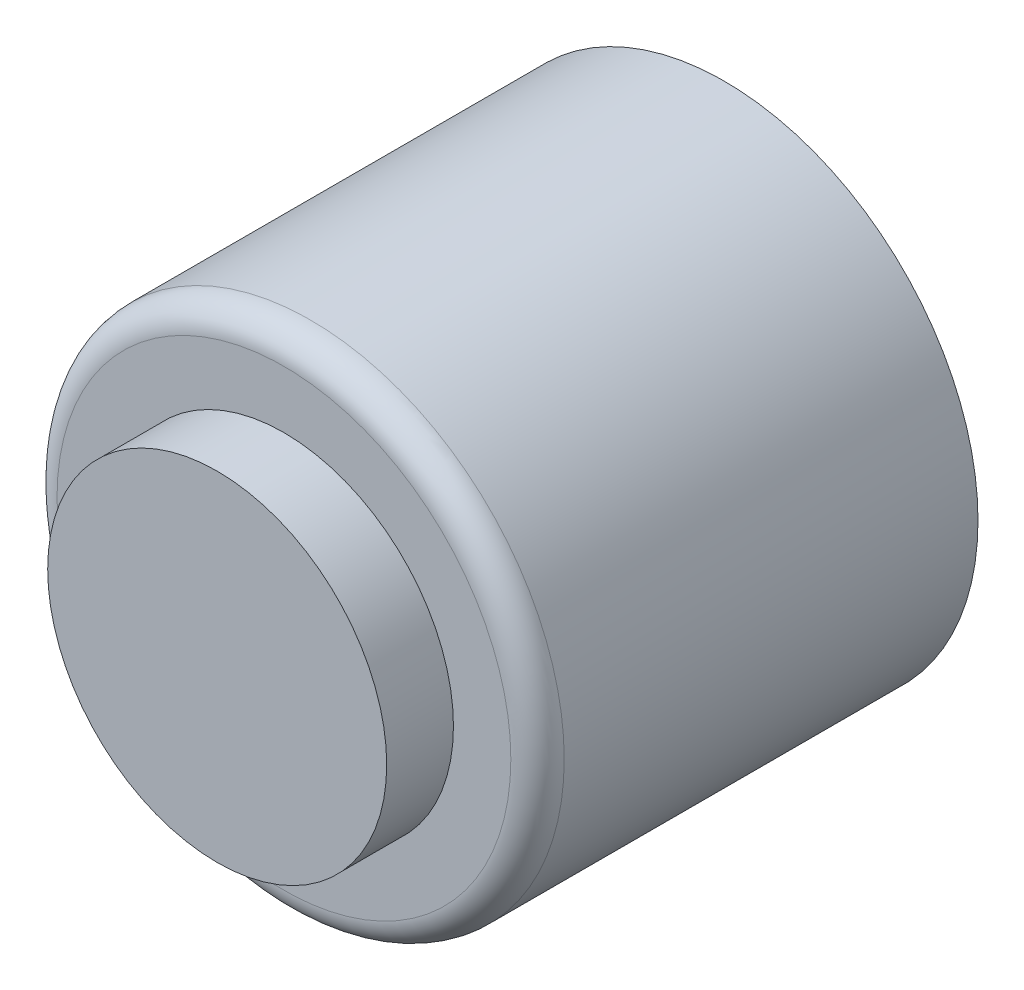
ISO-10303-21;
HEADER;
FILE_DESCRIPTION(('STEP AP214'),'2;1');
FILE_NAME('part.step','',(''),(''),'','','');
FILE_SCHEMA(('AUTOMOTIVE_DESIGN { 1 0 10303 214 1 1 1 1 }'));
ENDSEC;
DATA;
#1=APPLICATION_CONTEXT('core data for automotive mechanical design processes');
#2=APPLICATION_PROTOCOL_DEFINITION('international standard','automotive_design',2000,#1);
#3=PRODUCT_CONTEXT('',#1,'mechanical');
#4=PRODUCT('Part','Part','',(#3));
#5=PRODUCT_RELATED_PRODUCT_CATEGORY('part','',(#4));
#6=PRODUCT_DEFINITION_FORMATION('','',#4);
#7=PRODUCT_DEFINITION_CONTEXT('part definition',#1,'design');
#8=PRODUCT_DEFINITION('design','',#6,#7);
#9=PRODUCT_DEFINITION_SHAPE('','',#8);
#10=(LENGTH_UNIT() NAMED_UNIT(*) SI_UNIT(.MILLI.,.METRE.));
#11=(NAMED_UNIT(*) PLANE_ANGLE_UNIT() SI_UNIT($,.RADIAN.));
#12=(NAMED_UNIT(*) SI_UNIT($,.STERADIAN.) SOLID_ANGLE_UNIT());
#13=UNCERTAINTY_MEASURE_WITH_UNIT(LENGTH_MEASURE(1.E-05),#10,'distance_accuracy_value','');
#14=(GEOMETRIC_REPRESENTATION_CONTEXT(3) GLOBAL_UNCERTAINTY_ASSIGNED_CONTEXT((#13)) GLOBAL_UNIT_ASSIGNED_CONTEXT((#10,
#11,#12)) REPRESENTATION_CONTEXT('',''));
#15=CARTESIAN_POINT('',(0.,0.,0.));
#16=DIRECTION('',(0.,0.,1.));
#17=DIRECTION('',(1.,0.,0.));
#18=AXIS2_PLACEMENT_3D('',#15,#16,#17);
#19=CARTESIAN_POINT('',(0.,0.,0.));
#20=DIRECTION('',(0.,0.,1.));
#21=DIRECTION('',(1.,0.,0.));
#22=AXIS2_PLACEMENT_3D('',#19,#20,#21);
#23=PLANE('',#22);
#24=CARTESIAN_POINT('',(0.,0.,0.));
#25=DIRECTION('',(0.,0.,1.));
#26=DIRECTION('',(1.,0.,0.));
#27=AXIS2_PLACEMENT_3D('',#24,#25,#26);
#28=CIRCLE('',#27,12.7);
#29=CARTESIAN_POINT('',(12.7,0.,0.));
#30=VERTEX_POINT('',#29);
#31=EDGE_CURVE('E44',#30,#30,#28,.T.);
#32=ORIENTED_EDGE('',*,*,#31,.T.);
#33=EDGE_LOOP('',(#32));
#34=FACE_BOUND('',#33,.T.);
#35=ADVANCED_FACE('F33',(#34),#23,.T.);
#36=CARTESIAN_POINT('',(0.,0.,0.));
#37=DIRECTION('',(0.,0.,1.));
#38=DIRECTION('',(1.,0.,0.));
#39=AXIS2_PLACEMENT_3D('',#36,#37,#38);
#40=CYLINDRICAL_SURFACE('',#39,12.7);
#41=CARTESIAN_POINT('',(0.,0.,-5.));
#42=DIRECTION('',(0.,0.,1.));
#43=DIRECTION('',(1.,0.,0.));
#44=AXIS2_PLACEMENT_3D('',#41,#42,#43);
#45=CIRCLE('',#44,12.7);
#46=CARTESIAN_POINT('',(12.7,0.,-5.));
#47=VERTEX_POINT('',#46);
#48=EDGE_CURVE('E48',#47,#47,#45,.T.);
#49=ORIENTED_EDGE('',*,*,#48,.T.);
#50=EDGE_LOOP('',(#49));
#51=FACE_BOUND('',#50,.T.);
#52=ORIENTED_EDGE('',*,*,#31,.F.);
#53=EDGE_LOOP('',(#52));
#54=FACE_BOUND('',#53,.T.);
#55=ADVANCED_FACE('F77',(#51,#54),#40,.T.);
#56=CARTESIAN_POINT('',(0.,-12.7,-5.));
#57=DIRECTION('',(0.,0.,1.));
#58=DIRECTION('',(1.,0.,0.));
#59=AXIS2_PLACEMENT_3D('',#56,#57,#58);
#60=PLANE('',#59);
#61=CARTESIAN_POINT('',(0.,0.,-5.));
#62=DIRECTION('',(0.,0.,1.));
#63=DIRECTION('',(1.,0.,0.));
#64=AXIS2_PLACEMENT_3D('',#61,#62,#63);
#65=CIRCLE('',#64,17.);
#66=CARTESIAN_POINT('',(17.,0.,-5.));
#67=VERTEX_POINT('',#66);
#68=EDGE_CURVE('E40',#67,#67,#65,.T.);
#69=ORIENTED_EDGE('',*,*,#68,.T.);
#70=EDGE_LOOP('',(#69));
#71=FACE_BOUND('',#70,.T.);
#72=ORIENTED_EDGE('',*,*,#48,.F.);
#73=EDGE_LOOP('',(#72));
#74=FACE_BOUND('',#73,.T.);
#75=ADVANCED_FACE('F82',(#71,#74),#60,.T.);
#76=CARTESIAN_POINT('',(0.,0.,0.));
#77=DIRECTION('',(0.,0.,1.));
#78=DIRECTION('',(1.,0.,0.));
#79=AXIS2_PLACEMENT_3D('',#76,#77,#78);
#80=CYLINDRICAL_SURFACE('',#79,19.);
#81=CARTESIAN_POINT('',(0.,0.,-7.));
#82=DIRECTION('',(0.,0.,1.));
#83=DIRECTION('',(1.,0.,0.));
#84=AXIS2_PLACEMENT_3D('',#81,#82,#83);
#85=CIRCLE('',#84,19.);
#86=CARTESIAN_POINT('',(19.,0.,-7.));
#87=VERTEX_POINT('',#86);
#88=EDGE_CURVE('E10',#87,#87,#85,.F.);
#89=ORIENTED_EDGE('',*,*,#88,.T.);
#90=EDGE_LOOP('',(#89));
#91=FACE_BOUND('',#90,.T.);
#92=CARTESIAN_POINT('',(0.,0.,-38.));
#93=DIRECTION('',(0.,0.,1.));
#94=DIRECTION('',(1.,0.,0.));
#95=AXIS2_PLACEMENT_3D('',#92,#93,#94);
#96=CIRCLE('',#95,19.);
#97=CARTESIAN_POINT('',(19.,0.,-38.));
#98=VERTEX_POINT('',#97);
#99=EDGE_CURVE('E53',#98,#98,#96,.T.);
#100=ORIENTED_EDGE('',*,*,#99,.T.);
#101=EDGE_LOOP('',(#100));
#102=FACE_BOUND('',#101,.T.);
#103=ADVANCED_FACE('F88',(#91,#102),#80,.T.);
#104=CARTESIAN_POINT('',(0.,-19.,-38.));
#105=DIRECTION('',(0.,0.,-1.));
#106=DIRECTION('',(-1.,0.,0.));
#107=AXIS2_PLACEMENT_3D('',#104,#105,#106);
#108=PLANE('',#107);
#109=CARTESIAN_POINT('',(0.,0.,-38.));
#110=DIRECTION('',(0.,0.,1.));
#111=DIRECTION('',(1.,0.,0.));
#112=AXIS2_PLACEMENT_3D('',#109,#110,#111);
#113=CIRCLE('',#112,18.);
#114=CARTESIAN_POINT('',(18.,0.,-38.));
#115=VERTEX_POINT('',#114);
#116=EDGE_CURVE('E56',#115,#115,#113,.T.);
#117=ORIENTED_EDGE('',*,*,#116,.T.);
#118=EDGE_LOOP('',(#117));
#119=FACE_BOUND('',#118,.T.);
#120=ORIENTED_EDGE('',*,*,#99,.F.);
#121=EDGE_LOOP('',(#120));
#122=FACE_BOUND('',#121,.T.);
#123=ADVANCED_FACE('F74',(#119,#122),#108,.T.);
#124=CARTESIAN_POINT('',(0.,0.,-38.));
#125=DIRECTION('',(0.,0.,-1.));
#126=DIRECTION('',(-1.,0.,0.));
#127=AXIS2_PLACEMENT_3D('',#124,#125,#126);
#128=CONICAL_SURFACE('',#127,18.,0.785398163397443);
#129=CARTESIAN_POINT('',(0.,0.,-34.51743479135));
#130=DIRECTION('',(0.,0.,1.));
#131=DIRECTION('',(1.,0.,0.));
#132=AXIS2_PLACEMENT_3D('',#129,#130,#131);
#133=CIRCLE('',#132,14.51743479135);
#134=CARTESIAN_POINT('',(14.51743479135,0.,-34.51743479135));
#135=VERTEX_POINT('',#134);
#136=EDGE_CURVE('E59',#135,#135,#133,.T.);
#137=ORIENTED_EDGE('',*,*,#136,.T.);
#138=EDGE_LOOP('',(#137));
#139=FACE_BOUND('',#138,.T.);
#140=ORIENTED_EDGE('',*,*,#116,.F.);
#141=EDGE_LOOP('',(#140));
#142=FACE_BOUND('',#141,.T.);
#143=ADVANCED_FACE('F63',(#139,#142),#128,.F.);
#144=CARTESIAN_POINT('',(0.,0.,-6.));
#145=DIRECTION('',(0.,0.,1.));
#146=DIRECTION('',(0.,-1.,0.));
#147=AXIS2_PLACEMENT_3D('',#144,#145,#146);
#148=SPHERICAL_SURFACE('',#147,32.);
#149=ORIENTED_EDGE('',*,*,#136,.F.);
#150=EDGE_LOOP('',(#149));
#151=FACE_BOUND('',#150,.T.);
#152=ADVANCED_FACE('F66',(#151),#148,.T.);
#153=CARTESIAN_POINT('',(0.,0.,-7.));
#154=DIRECTION('',(0.,0.,1.));
#155=DIRECTION('',(1.,0.,0.));
#156=AXIS2_PLACEMENT_3D('',#153,#154,#155);
#157=TOROIDAL_SURFACE('',#156,17.,2.);
#158=ORIENTED_EDGE('',*,*,#88,.F.);
#159=EDGE_LOOP('',(#158));
#160=FACE_BOUND('',#159,.T.);
#161=ORIENTED_EDGE('',*,*,#68,.F.);
#162=EDGE_LOOP('',(#161));
#163=FACE_BOUND('',#162,.T.);
#164=ADVANCED_FACE('F35',(#160,#163),#157,.T.);
#165=CLOSED_SHELL('',(#35,#55,#75,#103,#123,#143,#152,#164));
#166=MANIFOLD_SOLID_BREP('B2',#165);
#167=ADVANCED_BREP_SHAPE_REPRESENTATION('',(#18,#166),#14);
#168=SHAPE_DEFINITION_REPRESENTATION(#9,#167);
ENDSEC;
END-ISO-10303-21;
